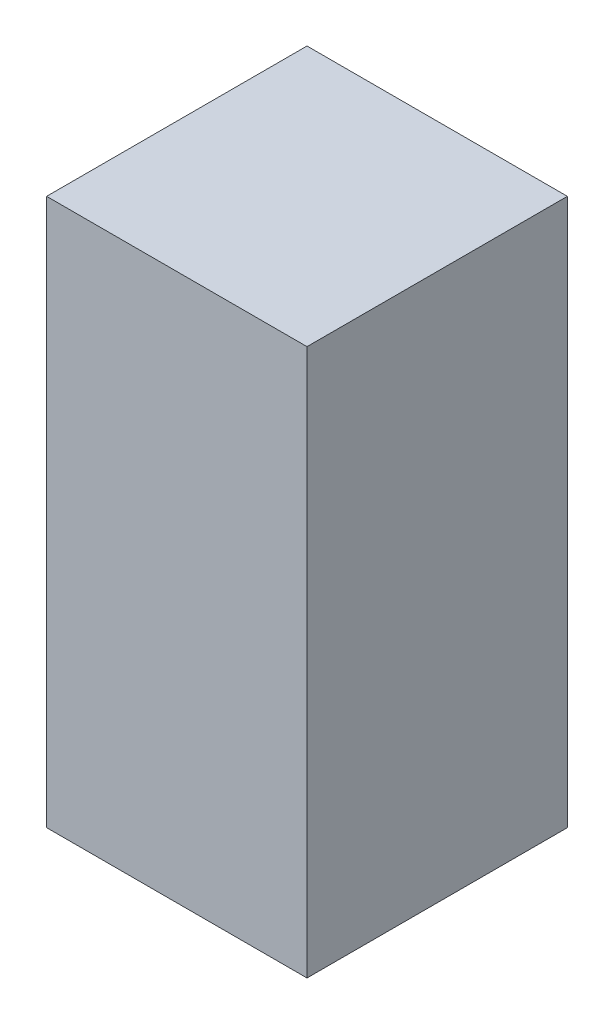
ISO-10303-21;
HEADER;
FILE_DESCRIPTION(('STEP AP214'),'2;1');
FILE_NAME('part.step','',(''),(''),'','','');
FILE_SCHEMA(('AUTOMOTIVE_DESIGN { 1 0 10303 214 1 1 1 1 }'));
ENDSEC;
DATA;
#1=APPLICATION_CONTEXT('core data for automotive mechanical design processes');
#2=APPLICATION_PROTOCOL_DEFINITION('international standard','automotive_design',2000,#1);
#3=PRODUCT_CONTEXT('',#1,'mechanical');
#4=PRODUCT('Part','Part','',(#3));
#5=PRODUCT_RELATED_PRODUCT_CATEGORY('part','',(#4));
#6=PRODUCT_DEFINITION_FORMATION('','',#4);
#7=PRODUCT_DEFINITION_CONTEXT('part definition',#1,'design');
#8=PRODUCT_DEFINITION('design','',#6,#7);
#9=PRODUCT_DEFINITION_SHAPE('','',#8);
#10=(LENGTH_UNIT() NAMED_UNIT(*) SI_UNIT(.MILLI.,.METRE.));
#11=(NAMED_UNIT(*) PLANE_ANGLE_UNIT() SI_UNIT($,.RADIAN.));
#12=(NAMED_UNIT(*) SI_UNIT($,.STERADIAN.) SOLID_ANGLE_UNIT());
#13=UNCERTAINTY_MEASURE_WITH_UNIT(LENGTH_MEASURE(1.E-05),#10,'distance_accuracy_value','');
#14=(GEOMETRIC_REPRESENTATION_CONTEXT(3) GLOBAL_UNCERTAINTY_ASSIGNED_CONTEXT((#13)) GLOBAL_UNIT_ASSIGNED_CONTEXT((#10,
#11,#12)) REPRESENTATION_CONTEXT('',''));
#15=CARTESIAN_POINT('',(0.,0.,0.));
#16=DIRECTION('',(0.,0.,1.));
#17=DIRECTION('',(1.,0.,0.));
#18=AXIS2_PLACEMENT_3D('',#15,#16,#17);
#19=CARTESIAN_POINT('',(0.,0.,100.));
#20=DIRECTION('',(1.,0.,0.));
#21=DIRECTION('',(0.,0.,-1.));
#22=AXIS2_PLACEMENT_3D('',#19,#20,#21);
#23=PLANE('',#22);
#24=DIRECTION('',(0.,-1.,0.));
#25=VECTOR('',#24,1.);
#26=CARTESIAN_POINT('',(0.,0.,0.));
#27=LINE('',#26,#25);
#28=CARTESIAN_POINT('',(0.,210.,0.));
#29=VERTEX_POINT('',#28);
#30=CARTESIAN_POINT('',(0.,0.,0.));
#31=VERTEX_POINT('',#30);
#32=EDGE_CURVE('E96',#29,#31,#27,.T.);
#33=ORIENTED_EDGE('',*,*,#32,.T.);
#34=DIRECTION('',(0.,0.,-1.));
#35=VECTOR('',#34,1.);
#36=CARTESIAN_POINT('',(0.,0.,100.));
#37=LINE('',#36,#35);
#38=CARTESIAN_POINT('',(0.,0.,100.));
#39=VERTEX_POINT('',#38);
#40=EDGE_CURVE('E11',#39,#31,#37,.T.);
#41=ORIENTED_EDGE('',*,*,#40,.F.);
#42=DIRECTION('',(0.,-1.,0.));
#43=VECTOR('',#42,1.);
#44=CARTESIAN_POINT('',(0.,0.,100.));
#45=LINE('',#44,#43);
#46=CARTESIAN_POINT('',(0.,210.,100.));
#47=VERTEX_POINT('',#46);
#48=EDGE_CURVE('E84',#47,#39,#45,.T.);
#49=ORIENTED_EDGE('',*,*,#48,.F.);
#50=DIRECTION('',(0.,0.,-1.));
#51=VECTOR('',#50,1.);
#52=CARTESIAN_POINT('',(0.,210.,100.));
#53=LINE('',#52,#51);
#54=EDGE_CURVE('E92',#47,#29,#53,.T.);
#55=ORIENTED_EDGE('',*,*,#54,.T.);
#56=EDGE_LOOP('',(#33,#41,#49,#55));
#57=FACE_BOUND('',#56,.T.);
#58=ADVANCED_FACE('F33',(#57),#23,.F.);
#59=CARTESIAN_POINT('',(0.,0.,100.));
#60=DIRECTION('',(0.,1.,0.));
#61=DIRECTION('',(0.,0.,1.));
#62=AXIS2_PLACEMENT_3D('',#59,#60,#61);
#63=PLANE('',#62);
#64=DIRECTION('',(1.,0.,0.));
#65=VECTOR('',#64,1.);
#66=CARTESIAN_POINT('',(0.,0.,0.));
#67=LINE('',#66,#65);
#68=CARTESIAN_POINT('',(100.,0.,0.));
#69=VERTEX_POINT('',#68);
#70=EDGE_CURVE('E88',#31,#69,#67,.T.);
#71=ORIENTED_EDGE('',*,*,#70,.T.);
#72=DIRECTION('',(0.,0.,-1.));
#73=VECTOR('',#72,1.);
#74=CARTESIAN_POINT('',(100.,0.,100.));
#75=LINE('',#74,#73);
#76=CARTESIAN_POINT('',(100.,0.,100.));
#77=VERTEX_POINT('',#76);
#78=EDGE_CURVE('E41',#77,#69,#75,.T.);
#79=ORIENTED_EDGE('',*,*,#78,.F.);
#80=DIRECTION('',(1.,0.,0.));
#81=VECTOR('',#80,1.);
#82=CARTESIAN_POINT('',(0.,0.,100.));
#83=LINE('',#82,#81);
#84=EDGE_CURVE('E79',#39,#77,#83,.T.);
#85=ORIENTED_EDGE('',*,*,#84,.F.);
#86=ORIENTED_EDGE('',*,*,#40,.T.);
#87=EDGE_LOOP('',(#71,#79,#85,#86));
#88=FACE_BOUND('',#87,.T.);
#89=ADVANCED_FACE('F87',(#88),#63,.F.);
#90=CARTESIAN_POINT('',(100.,0.,100.));
#91=DIRECTION('',(-1.,0.,0.));
#92=DIRECTION('',(0.,0.,1.));
#93=AXIS2_PLACEMENT_3D('',#90,#91,#92);
#94=PLANE('',#93);
#95=DIRECTION('',(0.,1.,0.));
#96=VECTOR('',#95,1.);
#97=CARTESIAN_POINT('',(100.,0.,0.));
#98=LINE('',#97,#96);
#99=CARTESIAN_POINT('',(100.,210.,0.));
#100=VERTEX_POINT('',#99);
#101=EDGE_CURVE('E66',#69,#100,#98,.T.);
#102=ORIENTED_EDGE('',*,*,#101,.T.);
#103=DIRECTION('',(0.,0.,-1.));
#104=VECTOR('',#103,1.);
#105=CARTESIAN_POINT('',(100.,210.,100.));
#106=LINE('',#105,#104);
#107=CARTESIAN_POINT('',(100.,210.,100.));
#108=VERTEX_POINT('',#107);
#109=EDGE_CURVE('E89',#108,#100,#106,.T.);
#110=ORIENTED_EDGE('',*,*,#109,.F.);
#111=DIRECTION('',(0.,1.,0.));
#112=VECTOR('',#111,1.);
#113=CARTESIAN_POINT('',(100.,0.,100.));
#114=LINE('',#113,#112);
#115=EDGE_CURVE('E82',#77,#108,#114,.T.);
#116=ORIENTED_EDGE('',*,*,#115,.F.);
#117=ORIENTED_EDGE('',*,*,#78,.T.);
#118=EDGE_LOOP('',(#102,#110,#116,#117));
#119=FACE_BOUND('',#118,.T.);
#120=ADVANCED_FACE('F90',(#119),#94,.F.);
#121=CARTESIAN_POINT('',(0.,210.,100.));
#122=DIRECTION('',(0.,-1.,0.));
#123=DIRECTION('',(0.,0.,-1.));
#124=AXIS2_PLACEMENT_3D('',#121,#122,#123);
#125=PLANE('',#124);
#126=DIRECTION('',(-1.,0.,0.));
#127=VECTOR('',#126,1.);
#128=CARTESIAN_POINT('',(0.,210.,0.));
#129=LINE('',#128,#127);
#130=EDGE_CURVE('E72',#100,#29,#129,.T.);
#131=ORIENTED_EDGE('',*,*,#130,.T.);
#132=ORIENTED_EDGE('',*,*,#54,.F.);
#133=DIRECTION('',(-1.,0.,0.));
#134=VECTOR('',#133,1.);
#135=CARTESIAN_POINT('',(0.,210.,100.));
#136=LINE('',#135,#134);
#137=EDGE_CURVE('E49',#108,#47,#136,.T.);
#138=ORIENTED_EDGE('',*,*,#137,.F.);
#139=ORIENTED_EDGE('',*,*,#109,.T.);
#140=EDGE_LOOP('',(#131,#132,#138,#139));
#141=FACE_BOUND('',#140,.T.);
#142=ADVANCED_FACE('F103',(#141),#125,.F.);
#143=CARTESIAN_POINT('',(0.,0.,100.));
#144=DIRECTION('',(0.,0.,-1.));
#145=DIRECTION('',(-1.,0.,0.));
#146=AXIS2_PLACEMENT_3D('',#143,#144,#145);
#147=PLANE('',#146);
#148=ORIENTED_EDGE('',*,*,#48,.T.);
#149=ORIENTED_EDGE('',*,*,#84,.T.);
#150=ORIENTED_EDGE('',*,*,#115,.T.);
#151=ORIENTED_EDGE('',*,*,#137,.T.);
#152=EDGE_LOOP('',(#148,#149,#150,#151));
#153=FACE_BOUND('',#152,.T.);
#154=ADVANCED_FACE('F80',(#153),#147,.F.);
#155=CARTESIAN_POINT('',(0.,0.,0.));
#156=DIRECTION('',(0.,0.,-1.));
#157=DIRECTION('',(-1.,0.,0.));
#158=AXIS2_PLACEMENT_3D('',#155,#156,#157);
#159=PLANE('',#158);
#160=ORIENTED_EDGE('',*,*,#32,.F.);
#161=ORIENTED_EDGE('',*,*,#130,.F.);
#162=ORIENTED_EDGE('',*,*,#101,.F.);
#163=ORIENTED_EDGE('',*,*,#70,.F.);
#164=EDGE_LOOP('',(#160,#161,#162,#163));
#165=FACE_BOUND('',#164,.T.);
#166=ADVANCED_FACE('F106',(#165),#159,.T.);
#167=CLOSED_SHELL('',(#58,#89,#120,#142,#154,#166));
#168=MANIFOLD_SOLID_BREP('B2',#167);
#169=ADVANCED_BREP_SHAPE_REPRESENTATION('',(#18,#168),#14);
#170=SHAPE_DEFINITION_REPRESENTATION(#9,#169);
ENDSEC;
END-ISO-10303-21;
